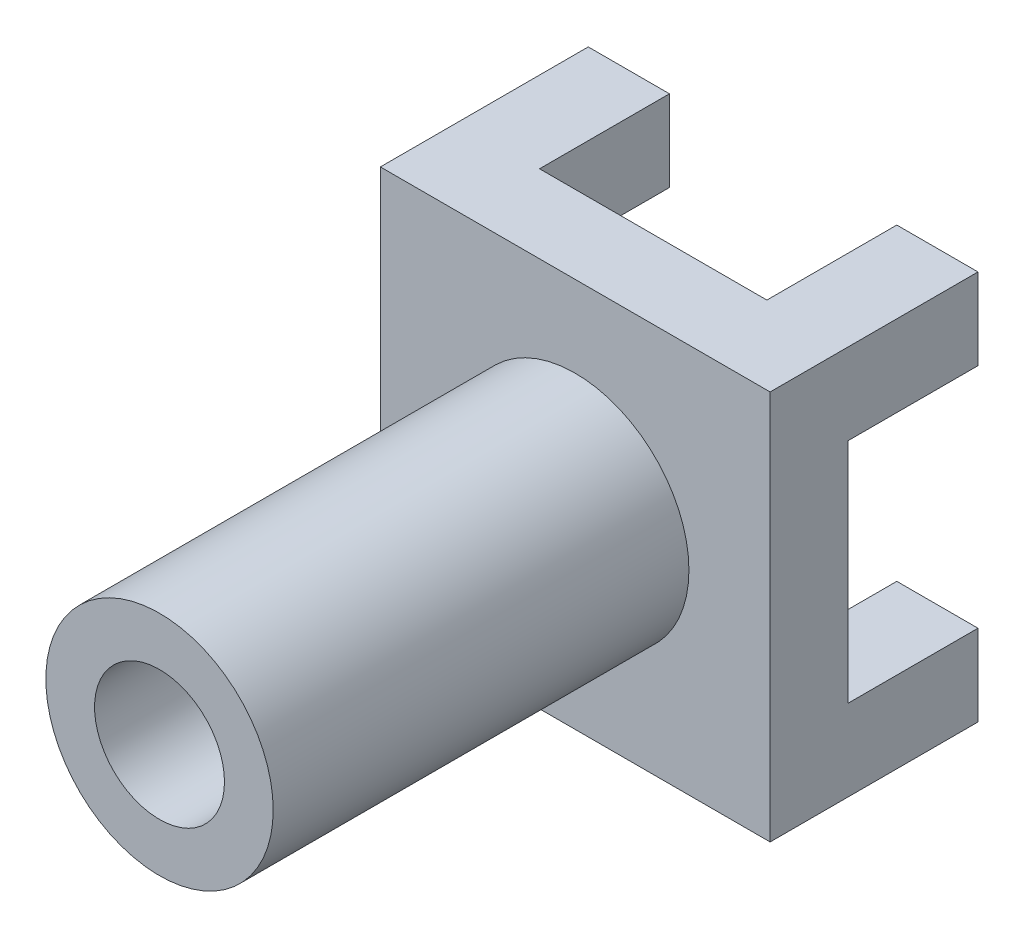
ISO-10303-21;
HEADER;
FILE_DESCRIPTION(('STEP AP214'),'2;1');
FILE_NAME('part.step','',(''),(''),'','','');
FILE_SCHEMA(('AUTOMOTIVE_DESIGN { 1 0 10303 214 1 1 1 1 }'));
ENDSEC;
DATA;
#1=APPLICATION_CONTEXT('core data for automotive mechanical design processes');
#2=APPLICATION_PROTOCOL_DEFINITION('international standard','automotive_design',2000,#1);
#3=PRODUCT_CONTEXT('',#1,'mechanical');
#4=PRODUCT('Part','Part','',(#3));
#5=PRODUCT_RELATED_PRODUCT_CATEGORY('part','',(#4));
#6=PRODUCT_DEFINITION_FORMATION('','',#4);
#7=PRODUCT_DEFINITION_CONTEXT('part definition',#1,'design');
#8=PRODUCT_DEFINITION('design','',#6,#7);
#9=PRODUCT_DEFINITION_SHAPE('','',#8);
#10=(LENGTH_UNIT() NAMED_UNIT(*) SI_UNIT(.MILLI.,.METRE.));
#11=(NAMED_UNIT(*) PLANE_ANGLE_UNIT() SI_UNIT($,.RADIAN.));
#12=(NAMED_UNIT(*) SI_UNIT($,.STERADIAN.) SOLID_ANGLE_UNIT());
#13=UNCERTAINTY_MEASURE_WITH_UNIT(LENGTH_MEASURE(1.E-05),#10,'distance_accuracy_value','');
#14=(GEOMETRIC_REPRESENTATION_CONTEXT(3) GLOBAL_UNCERTAINTY_ASSIGNED_CONTEXT((#13)) GLOBAL_UNIT_ASSIGNED_CONTEXT((#10,
#11,#12)) REPRESENTATION_CONTEXT('',''));
#15=CARTESIAN_POINT('',(0.,0.,0.));
#16=DIRECTION('',(0.,0.,1.));
#17=DIRECTION('',(1.,0.,0.));
#18=AXIS2_PLACEMENT_3D('',#15,#16,#17);
#19=CARTESIAN_POINT('',(0.,0.,-12.));
#20=DIRECTION('',(0.,0.,-1.));
#21=DIRECTION('',(-1.,0.,0.));
#22=AXIS2_PLACEMENT_3D('',#19,#20,#21);
#23=PLANE('',#22);
#24=CARTESIAN_POINT('',(30.,30.,-12.));
#25=DIRECTION('',(0.,0.,1.));
#26=DIRECTION('',(1.,0.,0.));
#27=AXIS2_PLACEMENT_3D('',#24,#25,#26);
#28=CIRCLE('',#27,10.);
#29=CARTESIAN_POINT('',(40.,30.,-12.));
#30=VERTEX_POINT('',#29);
#31=EDGE_CURVE('E296',#30,#30,#28,.T.);
#32=ORIENTED_EDGE('',*,*,#31,.T.);
#33=EDGE_LOOP('',(#32));
#34=FACE_BOUND('',#33,.T.);
#35=DIRECTION('',(1.,0.,0.));
#36=VECTOR('',#35,1.);
#37=CARTESIAN_POINT('',(0.,0.,-12.));
#38=LINE('',#37,#36);
#39=CARTESIAN_POINT('',(12.5,0.,-12.));
#40=VERTEX_POINT('',#39);
#41=CARTESIAN_POINT('',(47.5,0.,-12.));
#42=VERTEX_POINT('',#41);
#43=EDGE_CURVE('E187',#40,#42,#38,.T.);
#44=ORIENTED_EDGE('',*,*,#43,.F.);
#45=DIRECTION('',(0.,1.,0.));
#46=VECTOR('',#45,1.);
#47=CARTESIAN_POINT('',(12.5,0.,-12.));
#48=LINE('',#47,#46);
#49=CARTESIAN_POINT('',(12.5,12.5,-12.));
#50=VERTEX_POINT('',#49);
#51=EDGE_CURVE('E63',#40,#50,#48,.T.);
#52=ORIENTED_EDGE('',*,*,#51,.T.);
#53=DIRECTION('',(1.,0.,0.));
#54=VECTOR('',#53,1.);
#55=CARTESIAN_POINT('',(0.,12.5,-12.));
#56=LINE('',#55,#54);
#57=CARTESIAN_POINT('',(0.,12.5,-12.));
#58=VERTEX_POINT('',#57);
#59=EDGE_CURVE('E166',#58,#50,#56,.T.);
#60=ORIENTED_EDGE('',*,*,#59,.F.);
#61=DIRECTION('',(0.,-1.,0.));
#62=VECTOR('',#61,1.);
#63=CARTESIAN_POINT('',(0.,0.,-12.));
#64=LINE('',#63,#62);
#65=CARTESIAN_POINT('',(0.,47.5,-12.));
#66=VERTEX_POINT('',#65);
#67=EDGE_CURVE('E179',#66,#58,#64,.T.);
#68=ORIENTED_EDGE('',*,*,#67,.F.);
#69=DIRECTION('',(-1.,0.,0.));
#70=VECTOR('',#69,1.);
#71=CARTESIAN_POINT('',(0.,47.5,-12.));
#72=LINE('',#71,#70);
#73=CARTESIAN_POINT('',(12.5,47.5,-12.));
#74=VERTEX_POINT('',#73);
#75=EDGE_CURVE('E232',#74,#66,#72,.T.);
#76=ORIENTED_EDGE('',*,*,#75,.F.);
#77=DIRECTION('',(0.,-1.,0.));
#78=VECTOR('',#77,1.);
#79=CARTESIAN_POINT('',(12.5,60.,-12.));
#80=LINE('',#79,#78);
#81=CARTESIAN_POINT('',(12.5,60.,-12.));
#82=VERTEX_POINT('',#81);
#83=EDGE_CURVE('E236',#82,#74,#80,.T.);
#84=ORIENTED_EDGE('',*,*,#83,.F.);
#85=DIRECTION('',(-1.,0.,0.));
#86=VECTOR('',#85,1.);
#87=CARTESIAN_POINT('',(0.,60.,-12.));
#88=LINE('',#87,#86);
#89=CARTESIAN_POINT('',(47.5,60.,-12.));
#90=VERTEX_POINT('',#89);
#91=EDGE_CURVE('E198',#90,#82,#88,.T.);
#92=ORIENTED_EDGE('',*,*,#91,.F.);
#93=DIRECTION('',(0.,1.,0.));
#94=VECTOR('',#93,1.);
#95=CARTESIAN_POINT('',(47.5,47.5,-12.));
#96=LINE('',#95,#94);
#97=CARTESIAN_POINT('',(47.5,47.5,-12.));
#98=VERTEX_POINT('',#97);
#99=EDGE_CURVE('E271',#98,#90,#96,.T.);
#100=ORIENTED_EDGE('',*,*,#99,.F.);
#101=DIRECTION('',(-1.,0.,0.));
#102=VECTOR('',#101,1.);
#103=CARTESIAN_POINT('',(47.5,47.5,-12.));
#104=LINE('',#103,#102);
#105=CARTESIAN_POINT('',(60.,47.5,-12.));
#106=VERTEX_POINT('',#105);
#107=EDGE_CURVE('E276',#106,#98,#104,.T.);
#108=ORIENTED_EDGE('',*,*,#107,.F.);
#109=DIRECTION('',(0.,1.,0.));
#110=VECTOR('',#109,1.);
#111=CARTESIAN_POINT('',(60.,0.,-12.));
#112=LINE('',#111,#110);
#113=CARTESIAN_POINT('',(60.,12.5,-12.));
#114=VERTEX_POINT('',#113);
#115=EDGE_CURVE('E190',#114,#106,#112,.T.);
#116=ORIENTED_EDGE('',*,*,#115,.F.);
#117=DIRECTION('',(1.,0.,0.));
#118=VECTOR('',#117,1.);
#119=CARTESIAN_POINT('',(60.,12.5,-12.));
#120=LINE('',#119,#118);
#121=CARTESIAN_POINT('',(47.5,12.5,-12.));
#122=VERTEX_POINT('',#121);
#123=EDGE_CURVE('E256',#122,#114,#120,.T.);
#124=ORIENTED_EDGE('',*,*,#123,.F.);
#125=DIRECTION('',(0.,1.,0.));
#126=VECTOR('',#125,1.);
#127=CARTESIAN_POINT('',(47.5,0.,-12.));
#128=LINE('',#127,#126);
#129=EDGE_CURVE('E251',#42,#122,#128,.T.);
#130=ORIENTED_EDGE('',*,*,#129,.F.);
#131=EDGE_LOOP('',(#44,#52,#60,#68,#76,#84,#92,#100,#108,#116,#124,#130));
#132=FACE_BOUND('',#131,.T.);
#133=ADVANCED_FACE('F46',(#34,#132),#23,.T.);
#134=CARTESIAN_POINT('',(0.,0.,-12.));
#135=DIRECTION('',(-1.,0.,0.));
#136=DIRECTION('',(0.,-1.,0.));
#137=AXIS2_PLACEMENT_3D('',#134,#135,#136);
#138=PLANE('',#137);
#139=DIRECTION('',(0.,-1.,0.));
#140=VECTOR('',#139,1.);
#141=CARTESIAN_POINT('',(0.,0.,0.));
#142=LINE('',#141,#140);
#143=CARTESIAN_POINT('',(0.,60.,0.));
#144=VERTEX_POINT('',#143);
#145=CARTESIAN_POINT('',(0.,0.,0.));
#146=VERTEX_POINT('',#145);
#147=EDGE_CURVE('E201',#144,#146,#142,.T.);
#148=ORIENTED_EDGE('',*,*,#147,.F.);
#149=DIRECTION('',(0.,0.,1.));
#150=VECTOR('',#149,1.);
#151=CARTESIAN_POINT('',(0.,60.,-12.));
#152=LINE('',#151,#150);
#153=CARTESIAN_POINT('',(0.,60.,-32.));
#154=VERTEX_POINT('',#153);
#155=EDGE_CURVE('E55',#154,#144,#152,.T.);
#156=ORIENTED_EDGE('',*,*,#155,.F.);
#157=DIRECTION('',(0.,1.,0.));
#158=VECTOR('',#157,1.);
#159=CARTESIAN_POINT('',(0.,60.,-32.));
#160=LINE('',#159,#158);
#161=CARTESIAN_POINT('',(0.,47.5,-32.));
#162=VERTEX_POINT('',#161);
#163=EDGE_CURVE('E230',#162,#154,#160,.T.);
#164=ORIENTED_EDGE('',*,*,#163,.F.);
#165=DIRECTION('',(0.,0.,1.));
#166=VECTOR('',#165,1.);
#167=CARTESIAN_POINT('',(0.,47.5,-32.));
#168=LINE('',#167,#166);
#169=EDGE_CURVE('E186',#162,#66,#168,.T.);
#170=ORIENTED_EDGE('',*,*,#169,.T.);
#171=ORIENTED_EDGE('',*,*,#67,.T.);
#172=DIRECTION('',(0.,0.,-1.));
#173=VECTOR('',#172,1.);
#174=CARTESIAN_POINT('',(0.,12.5,-12.));
#175=LINE('',#174,#173);
#176=CARTESIAN_POINT('',(0.,12.5,-32.));
#177=VERTEX_POINT('',#176);
#178=EDGE_CURVE('E163',#58,#177,#175,.T.);
#179=ORIENTED_EDGE('',*,*,#178,.T.);
#180=DIRECTION('',(0.,1.,0.));
#181=VECTOR('',#180,1.);
#182=CARTESIAN_POINT('',(0.,0.,-32.));
#183=LINE('',#182,#181);
#184=CARTESIAN_POINT('',(0.,0.,-32.));
#185=VERTEX_POINT('',#184);
#186=EDGE_CURVE('E217',#185,#177,#183,.T.);
#187=ORIENTED_EDGE('',*,*,#186,.F.);
#188=DIRECTION('',(0.,0.,1.));
#189=VECTOR('',#188,1.);
#190=CARTESIAN_POINT('',(0.,0.,-12.));
#191=LINE('',#190,#189);
#192=EDGE_CURVE('E50',#185,#146,#191,.T.);
#193=ORIENTED_EDGE('',*,*,#192,.T.);
#194=EDGE_LOOP('',(#148,#156,#164,#170,#171,#179,#187,#193));
#195=FACE_BOUND('',#194,.T.);
#196=ADVANCED_FACE('F48',(#195),#138,.T.);
#197=CARTESIAN_POINT('',(0.,60.,-12.));
#198=DIRECTION('',(0.,1.,0.));
#199=DIRECTION('',(0.,0.,1.));
#200=AXIS2_PLACEMENT_3D('',#197,#198,#199);
#201=PLANE('',#200);
#202=DIRECTION('',(-1.,0.,0.));
#203=VECTOR('',#202,1.);
#204=CARTESIAN_POINT('',(0.,60.,0.));
#205=LINE('',#204,#203);
#206=CARTESIAN_POINT('',(60.,60.,0.));
#207=VERTEX_POINT('',#206);
#208=EDGE_CURVE('E188',#207,#144,#205,.T.);
#209=ORIENTED_EDGE('',*,*,#208,.F.);
#210=DIRECTION('',(0.,0.,1.));
#211=VECTOR('',#210,1.);
#212=CARTESIAN_POINT('',(60.,60.,-12.));
#213=LINE('',#212,#211);
#214=CARTESIAN_POINT('',(60.,60.,-32.));
#215=VERTEX_POINT('',#214);
#216=EDGE_CURVE('E211',#215,#207,#213,.T.);
#217=ORIENTED_EDGE('',*,*,#216,.F.);
#218=DIRECTION('',(1.,0.,0.));
#219=VECTOR('',#218,1.);
#220=CARTESIAN_POINT('',(47.5,60.,-32.));
#221=LINE('',#220,#219);
#222=CARTESIAN_POINT('',(47.5,60.,-32.));
#223=VERTEX_POINT('',#222);
#224=EDGE_CURVE('E275',#223,#215,#221,.T.);
#225=ORIENTED_EDGE('',*,*,#224,.F.);
#226=DIRECTION('',(0.,0.,1.));
#227=VECTOR('',#226,1.);
#228=CARTESIAN_POINT('',(47.5,60.,-32.));
#229=LINE('',#228,#227);
#230=EDGE_CURVE('E292',#223,#90,#229,.T.);
#231=ORIENTED_EDGE('',*,*,#230,.T.);
#232=ORIENTED_EDGE('',*,*,#91,.T.);
#233=DIRECTION('',(0.,0.,1.));
#234=VECTOR('',#233,1.);
#235=CARTESIAN_POINT('',(12.5,60.,-32.));
#236=LINE('',#235,#234);
#237=CARTESIAN_POINT('',(12.5,60.,-32.));
#238=VERTEX_POINT('',#237);
#239=EDGE_CURVE('E249',#238,#82,#236,.T.);
#240=ORIENTED_EDGE('',*,*,#239,.F.);
#241=DIRECTION('',(1.,0.,0.));
#242=VECTOR('',#241,1.);
#243=CARTESIAN_POINT('',(0.,60.,-32.));
#244=LINE('',#243,#242);
#245=EDGE_CURVE('E228',#154,#238,#244,.T.);
#246=ORIENTED_EDGE('',*,*,#245,.F.);
#247=ORIENTED_EDGE('',*,*,#155,.T.);
#248=EDGE_LOOP('',(#209,#217,#225,#231,#232,#240,#246,#247));
#249=FACE_BOUND('',#248,.T.);
#250=ADVANCED_FACE('F224',(#249),#201,.T.);
#251=CARTESIAN_POINT('',(60.,0.,-12.));
#252=DIRECTION('',(1.,0.,0.));
#253=DIRECTION('',(0.,1.,0.));
#254=AXIS2_PLACEMENT_3D('',#251,#252,#253);
#255=PLANE('',#254);
#256=DIRECTION('',(0.,1.,0.));
#257=VECTOR('',#256,1.);
#258=CARTESIAN_POINT('',(60.,0.,0.));
#259=LINE('',#258,#257);
#260=CARTESIAN_POINT('',(60.,0.,0.));
#261=VERTEX_POINT('',#260);
#262=EDGE_CURVE('E193',#261,#207,#259,.T.);
#263=ORIENTED_EDGE('',*,*,#262,.F.);
#264=DIRECTION('',(0.,0.,1.));
#265=VECTOR('',#264,1.);
#266=CARTESIAN_POINT('',(60.,0.,-12.));
#267=LINE('',#266,#265);
#268=CARTESIAN_POINT('',(60.,0.,-32.));
#269=VERTEX_POINT('',#268);
#270=EDGE_CURVE('E212',#269,#261,#267,.T.);
#271=ORIENTED_EDGE('',*,*,#270,.F.);
#272=DIRECTION('',(0.,-1.,0.));
#273=VECTOR('',#272,1.);
#274=CARTESIAN_POINT('',(60.,0.,-32.));
#275=LINE('',#274,#273);
#276=CARTESIAN_POINT('',(60.,12.5,-32.));
#277=VERTEX_POINT('',#276);
#278=EDGE_CURVE('E252',#277,#269,#275,.T.);
#279=ORIENTED_EDGE('',*,*,#278,.F.);
#280=DIRECTION('',(0.,0.,1.));
#281=VECTOR('',#280,1.);
#282=CARTESIAN_POINT('',(60.,12.5,-32.));
#283=LINE('',#282,#281);
#284=EDGE_CURVE('E262',#277,#114,#283,.T.);
#285=ORIENTED_EDGE('',*,*,#284,.T.);
#286=ORIENTED_EDGE('',*,*,#115,.T.);
#287=DIRECTION('',(0.,0.,1.));
#288=VECTOR('',#287,1.);
#289=CARTESIAN_POINT('',(60.,47.5,-32.));
#290=LINE('',#289,#288);
#291=CARTESIAN_POINT('',(60.,47.5,-32.));
#292=VERTEX_POINT('',#291);
#293=EDGE_CURVE('E289',#292,#106,#290,.T.);
#294=ORIENTED_EDGE('',*,*,#293,.F.);
#295=DIRECTION('',(0.,-1.,0.));
#296=VECTOR('',#295,1.);
#297=CARTESIAN_POINT('',(60.,47.5,-32.));
#298=LINE('',#297,#296);
#299=EDGE_CURVE('E278',#215,#292,#298,.T.);
#300=ORIENTED_EDGE('',*,*,#299,.F.);
#301=ORIENTED_EDGE('',*,*,#216,.T.);
#302=EDGE_LOOP('',(#263,#271,#279,#285,#286,#294,#300,#301));
#303=FACE_BOUND('',#302,.T.);
#304=ADVANCED_FACE('F316',(#303),#255,.T.);
#305=CARTESIAN_POINT('',(0.,0.,-12.));
#306=DIRECTION('',(0.,-1.,0.));
#307=DIRECTION('',(0.,0.,-1.));
#308=AXIS2_PLACEMENT_3D('',#305,#306,#307);
#309=PLANE('',#308);
#310=DIRECTION('',(1.,0.,0.));
#311=VECTOR('',#310,1.);
#312=CARTESIAN_POINT('',(0.,0.,0.));
#313=LINE('',#312,#311);
#314=EDGE_CURVE('E204',#146,#261,#313,.T.);
#315=ORIENTED_EDGE('',*,*,#314,.F.);
#316=ORIENTED_EDGE('',*,*,#192,.F.);
#317=DIRECTION('',(1.,0.,0.));
#318=VECTOR('',#317,1.);
#319=CARTESIAN_POINT('',(0.,0.,-32.));
#320=LINE('',#319,#318);
#321=CARTESIAN_POINT('',(12.5,0.,-32.));
#322=VERTEX_POINT('',#321);
#323=EDGE_CURVE('E180',#185,#322,#320,.T.);
#324=ORIENTED_EDGE('',*,*,#323,.T.);
#325=DIRECTION('',(0.,0.,-1.));
#326=VECTOR('',#325,1.);
#327=CARTESIAN_POINT('',(12.5,0.,-12.));
#328=LINE('',#327,#326);
#329=EDGE_CURVE('E243',#40,#322,#328,.T.);
#330=ORIENTED_EDGE('',*,*,#329,.F.);
#331=ORIENTED_EDGE('',*,*,#43,.T.);
#332=DIRECTION('',(0.,0.,1.));
#333=VECTOR('',#332,1.);
#334=CARTESIAN_POINT('',(47.5,0.,-32.));
#335=LINE('',#334,#333);
#336=CARTESIAN_POINT('',(47.5,0.,-32.));
#337=VERTEX_POINT('',#336);
#338=EDGE_CURVE('E268',#337,#42,#335,.T.);
#339=ORIENTED_EDGE('',*,*,#338,.F.);
#340=DIRECTION('',(-1.,0.,0.));
#341=VECTOR('',#340,1.);
#342=CARTESIAN_POINT('',(60.,0.,-32.));
#343=LINE('',#342,#341);
#344=EDGE_CURVE('E255',#269,#337,#343,.T.);
#345=ORIENTED_EDGE('',*,*,#344,.F.);
#346=ORIENTED_EDGE('',*,*,#270,.T.);
#347=EDGE_LOOP('',(#315,#316,#324,#330,#331,#339,#345,#346));
#348=FACE_BOUND('',#347,.T.);
#349=ADVANCED_FACE('F219',(#348),#309,.T.);
#350=CARTESIAN_POINT('',(0.,0.,0.));
#351=DIRECTION('',(0.,0.,-1.));
#352=DIRECTION('',(-1.,0.,0.));
#353=AXIS2_PLACEMENT_3D('',#350,#351,#352);
#354=PLANE('',#353);
#355=CARTESIAN_POINT('',(30.,30.,0.));
#356=DIRECTION('',(0.,0.,1.));
#357=DIRECTION('',(1.,0.,0.));
#358=AXIS2_PLACEMENT_3D('',#355,#356,#357);
#359=CIRCLE('',#358,17.5);
#360=CARTESIAN_POINT('',(47.5,30.,0.));
#361=VERTEX_POINT('',#360);
#362=EDGE_CURVE('E13',#361,#361,#359,.T.);
#363=ORIENTED_EDGE('',*,*,#362,.F.);
#364=EDGE_LOOP('',(#363));
#365=FACE_BOUND('',#364,.T.);
#366=ORIENTED_EDGE('',*,*,#147,.T.);
#367=ORIENTED_EDGE('',*,*,#314,.T.);
#368=ORIENTED_EDGE('',*,*,#262,.T.);
#369=ORIENTED_EDGE('',*,*,#208,.T.);
#370=EDGE_LOOP('',(#366,#367,#368,#369));
#371=FACE_BOUND('',#370,.T.);
#372=ADVANCED_FACE('F221',(#365,#371),#354,.F.);
#373=CARTESIAN_POINT('',(30.,30.,64.));
#374=DIRECTION('',(0.,0.,-1.));
#375=DIRECTION('',(-1.,0.,0.));
#376=AXIS2_PLACEMENT_3D('',#373,#374,#375);
#377=CYLINDRICAL_SURFACE('',#376,17.5);
#378=CARTESIAN_POINT('',(30.,30.,64.));
#379=DIRECTION('',(0.,0.,1.));
#380=DIRECTION('',(1.,0.,0.));
#381=AXIS2_PLACEMENT_3D('',#378,#379,#380);
#382=CIRCLE('',#381,17.5);
#383=CARTESIAN_POINT('',(47.5,30.,64.));
#384=VERTEX_POINT('',#383);
#385=EDGE_CURVE('E205',#384,#384,#382,.T.);
#386=ORIENTED_EDGE('',*,*,#385,.F.);
#387=EDGE_LOOP('',(#386));
#388=FACE_BOUND('',#387,.T.);
#389=ORIENTED_EDGE('',*,*,#362,.T.);
#390=EDGE_LOOP('',(#389));
#391=FACE_BOUND('',#390,.T.);
#392=ADVANCED_FACE('F305',(#388,#391),#377,.T.);
#393=CARTESIAN_POINT('',(30.,30.,64.));
#394=DIRECTION('',(0.,0.,1.));
#395=DIRECTION('',(1.,0.,0.));
#396=AXIS2_PLACEMENT_3D('',#393,#394,#395);
#397=PLANE('',#396);
#398=CARTESIAN_POINT('',(30.,30.,64.));
#399=DIRECTION('',(0.,0.,1.));
#400=DIRECTION('',(1.,0.,0.));
#401=AXIS2_PLACEMENT_3D('',#398,#399,#400);
#402=CIRCLE('',#401,10.);
#403=CARTESIAN_POINT('',(40.,30.,64.));
#404=VERTEX_POINT('',#403);
#405=EDGE_CURVE('E295',#404,#404,#402,.T.);
#406=ORIENTED_EDGE('',*,*,#405,.F.);
#407=EDGE_LOOP('',(#406));
#408=FACE_BOUND('',#407,.T.);
#409=ORIENTED_EDGE('',*,*,#385,.T.);
#410=EDGE_LOOP('',(#409));
#411=FACE_BOUND('',#410,.T.);
#412=ADVANCED_FACE('F303',(#408,#411),#397,.T.);
#413=CARTESIAN_POINT('',(30.,30.,-12.));
#414=DIRECTION('',(0.,0.,1.));
#415=DIRECTION('',(1.,0.,0.));
#416=AXIS2_PLACEMENT_3D('',#413,#414,#415);
#417=CYLINDRICAL_SURFACE('',#416,10.);
#418=ORIENTED_EDGE('',*,*,#31,.F.);
#419=EDGE_LOOP('',(#418));
#420=FACE_BOUND('',#419,.T.);
#421=ORIENTED_EDGE('',*,*,#405,.T.);
#422=EDGE_LOOP('',(#421));
#423=FACE_BOUND('',#422,.T.);
#424=ADVANCED_FACE('F327',(#420,#423),#417,.F.);
#425=CARTESIAN_POINT('',(47.5,47.5,-32.));
#426=DIRECTION('',(1.,0.,0.));
#427=DIRECTION('',(0.,0.,-1.));
#428=AXIS2_PLACEMENT_3D('',#425,#426,#427);
#429=PLANE('',#428);
#430=ORIENTED_EDGE('',*,*,#99,.T.);
#431=ORIENTED_EDGE('',*,*,#230,.F.);
#432=DIRECTION('',(0.,1.,0.));
#433=VECTOR('',#432,1.);
#434=CARTESIAN_POINT('',(47.5,47.5,-32.));
#435=LINE('',#434,#433);
#436=CARTESIAN_POINT('',(47.5,47.5,-32.));
#437=VERTEX_POINT('',#436);
#438=EDGE_CURVE('E272',#437,#223,#435,.T.);
#439=ORIENTED_EDGE('',*,*,#438,.F.);
#440=DIRECTION('',(0.,0.,1.));
#441=VECTOR('',#440,1.);
#442=CARTESIAN_POINT('',(47.5,47.5,-32.));
#443=LINE('',#442,#441);
#444=EDGE_CURVE('E282',#437,#98,#443,.T.);
#445=ORIENTED_EDGE('',*,*,#444,.T.);
#446=EDGE_LOOP('',(#430,#431,#439,#445));
#447=FACE_BOUND('',#446,.T.);
#448=ADVANCED_FACE('F331',(#447),#429,.F.);
#449=CARTESIAN_POINT('',(47.5,47.5,-32.));
#450=DIRECTION('',(0.,1.,0.));
#451=DIRECTION('',(0.,0.,1.));
#452=AXIS2_PLACEMENT_3D('',#449,#450,#451);
#453=PLANE('',#452);
#454=ORIENTED_EDGE('',*,*,#107,.T.);
#455=ORIENTED_EDGE('',*,*,#444,.F.);
#456=DIRECTION('',(-1.,0.,0.));
#457=VECTOR('',#456,1.);
#458=CARTESIAN_POINT('',(47.5,47.5,-32.));
#459=LINE('',#458,#457);
#460=EDGE_CURVE('E280',#292,#437,#459,.T.);
#461=ORIENTED_EDGE('',*,*,#460,.F.);
#462=ORIENTED_EDGE('',*,*,#293,.T.);
#463=EDGE_LOOP('',(#454,#455,#461,#462));
#464=FACE_BOUND('',#463,.T.);
#465=ADVANCED_FACE('F335',(#464),#453,.F.);
#466=CARTESIAN_POINT('',(0.,0.,-32.));
#467=DIRECTION('',(0.,0.,-1.));
#468=DIRECTION('',(-1.,0.,0.));
#469=AXIS2_PLACEMENT_3D('',#466,#467,#468);
#470=PLANE('',#469);
#471=ORIENTED_EDGE('',*,*,#438,.T.);
#472=ORIENTED_EDGE('',*,*,#224,.T.);
#473=ORIENTED_EDGE('',*,*,#299,.T.);
#474=ORIENTED_EDGE('',*,*,#460,.T.);
#475=EDGE_LOOP('',(#471,#472,#473,#474));
#476=FACE_BOUND('',#475,.T.);
#477=ADVANCED_FACE('F339',(#476),#470,.T.);
#478=CARTESIAN_POINT('',(47.5,0.,-32.));
#479=DIRECTION('',(1.,0.,0.));
#480=DIRECTION('',(0.,0.,-1.));
#481=AXIS2_PLACEMENT_3D('',#478,#479,#480);
#482=PLANE('',#481);
#483=ORIENTED_EDGE('',*,*,#129,.T.);
#484=DIRECTION('',(0.,0.,1.));
#485=VECTOR('',#484,1.);
#486=CARTESIAN_POINT('',(47.5,12.5,-32.));
#487=LINE('',#486,#485);
#488=CARTESIAN_POINT('',(47.5,12.5,-32.));
#489=VERTEX_POINT('',#488);
#490=EDGE_CURVE('E71',#489,#122,#487,.T.);
#491=ORIENTED_EDGE('',*,*,#490,.F.);
#492=DIRECTION('',(0.,1.,0.));
#493=VECTOR('',#492,1.);
#494=CARTESIAN_POINT('',(47.5,0.,-32.));
#495=LINE('',#494,#493);
#496=EDGE_CURVE('E258',#337,#489,#495,.T.);
#497=ORIENTED_EDGE('',*,*,#496,.F.);
#498=ORIENTED_EDGE('',*,*,#338,.T.);
#499=EDGE_LOOP('',(#483,#491,#497,#498));
#500=FACE_BOUND('',#499,.T.);
#501=ADVANCED_FACE('F343',(#500),#482,.F.);
#502=CARTESIAN_POINT('',(60.,12.5,-32.));
#503=DIRECTION('',(0.,-1.,0.));
#504=DIRECTION('',(0.,0.,-1.));
#505=AXIS2_PLACEMENT_3D('',#502,#503,#504);
#506=PLANE('',#505);
#507=ORIENTED_EDGE('',*,*,#123,.T.);
#508=ORIENTED_EDGE('',*,*,#284,.F.);
#509=DIRECTION('',(1.,0.,0.));
#510=VECTOR('',#509,1.);
#511=CARTESIAN_POINT('',(60.,12.5,-32.));
#512=LINE('',#511,#510);
#513=EDGE_CURVE('E260',#489,#277,#512,.T.);
#514=ORIENTED_EDGE('',*,*,#513,.F.);
#515=ORIENTED_EDGE('',*,*,#490,.T.);
#516=EDGE_LOOP('',(#507,#508,#514,#515));
#517=FACE_BOUND('',#516,.T.);
#518=ADVANCED_FACE('F347',(#517),#506,.F.);
#519=CARTESIAN_POINT('',(0.,0.,-32.));
#520=DIRECTION('',(0.,0.,1.));
#521=DIRECTION('',(1.,0.,0.));
#522=AXIS2_PLACEMENT_3D('',#519,#520,#521);
#523=PLANE('',#522);
#524=ORIENTED_EDGE('',*,*,#278,.T.);
#525=ORIENTED_EDGE('',*,*,#344,.T.);
#526=ORIENTED_EDGE('',*,*,#496,.T.);
#527=ORIENTED_EDGE('',*,*,#513,.T.);
#528=EDGE_LOOP('',(#524,#525,#526,#527));
#529=FACE_BOUND('',#528,.T.);
#530=ADVANCED_FACE('F351',(#529),#523,.F.);
#531=CARTESIAN_POINT('',(12.5,60.,-32.));
#532=DIRECTION('',(-1.,0.,0.));
#533=DIRECTION('',(0.,-1.,0.));
#534=AXIS2_PLACEMENT_3D('',#531,#532,#533);
#535=PLANE('',#534);
#536=ORIENTED_EDGE('',*,*,#83,.T.);
#537=DIRECTION('',(0.,0.,1.));
#538=VECTOR('',#537,1.);
#539=CARTESIAN_POINT('',(12.5,47.5,-32.));
#540=LINE('',#539,#538);
#541=CARTESIAN_POINT('',(12.5,47.5,-32.));
#542=VERTEX_POINT('',#541);
#543=EDGE_CURVE('E246',#542,#74,#540,.T.);
#544=ORIENTED_EDGE('',*,*,#543,.F.);
#545=DIRECTION('',(0.,-1.,0.));
#546=VECTOR('',#545,1.);
#547=CARTESIAN_POINT('',(12.5,60.,-32.));
#548=LINE('',#547,#546);
#549=EDGE_CURVE('E234',#238,#542,#548,.T.);
#550=ORIENTED_EDGE('',*,*,#549,.F.);
#551=ORIENTED_EDGE('',*,*,#239,.T.);
#552=EDGE_LOOP('',(#536,#544,#550,#551));
#553=FACE_BOUND('',#552,.T.);
#554=ADVANCED_FACE('F354',(#553),#535,.F.);
#555=CARTESIAN_POINT('',(0.,47.5,-32.));
#556=DIRECTION('',(0.,1.,0.));
#557=DIRECTION('',(0.,0.,1.));
#558=AXIS2_PLACEMENT_3D('',#555,#556,#557);
#559=PLANE('',#558);
#560=ORIENTED_EDGE('',*,*,#75,.T.);
#561=ORIENTED_EDGE('',*,*,#169,.F.);
#562=DIRECTION('',(-1.,0.,0.));
#563=VECTOR('',#562,1.);
#564=CARTESIAN_POINT('',(0.,47.5,-32.));
#565=LINE('',#564,#563);
#566=EDGE_CURVE('E241',#542,#162,#565,.T.);
#567=ORIENTED_EDGE('',*,*,#566,.F.);
#568=ORIENTED_EDGE('',*,*,#543,.T.);
#569=EDGE_LOOP('',(#560,#561,#567,#568));
#570=FACE_BOUND('',#569,.T.);
#571=ADVANCED_FACE('F358',(#570),#559,.F.);
#572=CARTESIAN_POINT('',(0.,0.,-32.));
#573=DIRECTION('',(0.,0.,1.));
#574=DIRECTION('',(1.,0.,0.));
#575=AXIS2_PLACEMENT_3D('',#572,#573,#574);
#576=PLANE('',#575);
#577=ORIENTED_EDGE('',*,*,#163,.T.);
#578=ORIENTED_EDGE('',*,*,#245,.T.);
#579=ORIENTED_EDGE('',*,*,#549,.T.);
#580=ORIENTED_EDGE('',*,*,#566,.T.);
#581=EDGE_LOOP('',(#577,#578,#579,#580));
#582=FACE_BOUND('',#581,.T.);
#583=ADVANCED_FACE('F362',(#582),#576,.F.);
#584=CARTESIAN_POINT('',(12.5,0.,-12.));
#585=DIRECTION('',(-1.,0.,0.));
#586=DIRECTION('',(0.,0.,1.));
#587=AXIS2_PLACEMENT_3D('',#584,#585,#586);
#588=PLANE('',#587);
#589=DIRECTION('',(0.,1.,0.));
#590=VECTOR('',#589,1.);
#591=CARTESIAN_POINT('',(12.5,0.,-32.));
#592=LINE('',#591,#590);
#593=CARTESIAN_POINT('',(12.5,12.5,-32.));
#594=VERTEX_POINT('',#593);
#595=EDGE_CURVE('E378',#322,#594,#592,.T.);
#596=ORIENTED_EDGE('',*,*,#595,.T.);
#597=DIRECTION('',(0.,0.,-1.));
#598=VECTOR('',#597,1.);
#599=CARTESIAN_POINT('',(12.5,12.5,-12.));
#600=LINE('',#599,#598);
#601=EDGE_CURVE('E173',#50,#594,#600,.T.);
#602=ORIENTED_EDGE('',*,*,#601,.F.);
#603=ORIENTED_EDGE('',*,*,#51,.F.);
#604=ORIENTED_EDGE('',*,*,#329,.T.);
#605=EDGE_LOOP('',(#596,#602,#603,#604));
#606=FACE_BOUND('',#605,.T.);
#607=ADVANCED_FACE('F366',(#606),#588,.F.);
#608=CARTESIAN_POINT('',(0.,12.5,-12.));
#609=DIRECTION('',(0.,1.,0.));
#610=DIRECTION('',(-1.,0.,0.));
#611=AXIS2_PLACEMENT_3D('',#608,#609,#610);
#612=PLANE('',#611);
#613=DIRECTION('',(1.,0.,0.));
#614=VECTOR('',#613,1.);
#615=CARTESIAN_POINT('',(0.,12.5,-32.));
#616=LINE('',#615,#614);
#617=EDGE_CURVE('E168',#177,#594,#616,.T.);
#618=ORIENTED_EDGE('',*,*,#617,.F.);
#619=ORIENTED_EDGE('',*,*,#178,.F.);
#620=ORIENTED_EDGE('',*,*,#59,.T.);
#621=ORIENTED_EDGE('',*,*,#601,.T.);
#622=EDGE_LOOP('',(#618,#619,#620,#621));
#623=FACE_BOUND('',#622,.T.);
#624=ADVANCED_FACE('F165',(#623),#612,.T.);
#625=CARTESIAN_POINT('',(0.,0.,-32.));
#626=DIRECTION('',(0.,0.,-1.));
#627=DIRECTION('',(-1.,0.,0.));
#628=AXIS2_PLACEMENT_3D('',#625,#626,#627);
#629=PLANE('',#628);
#630=ORIENTED_EDGE('',*,*,#186,.T.);
#631=ORIENTED_EDGE('',*,*,#617,.T.);
#632=ORIENTED_EDGE('',*,*,#595,.F.);
#633=ORIENTED_EDGE('',*,*,#323,.F.);
#634=EDGE_LOOP('',(#630,#631,#632,#633));
#635=FACE_BOUND('',#634,.T.);
#636=ADVANCED_FACE('F369',(#635),#629,.T.);
#637=CLOSED_SHELL('',(#133,#196,#250,#304,#349,#372,#392,#412,#424,#448,#465,#477,#501,#518,
#530,#554,#571,#583,#607,#624,#636));
#638=MANIFOLD_SOLID_BREP('B2',#637);
#639=ADVANCED_BREP_SHAPE_REPRESENTATION('',(#18,#638),#14);
#640=SHAPE_DEFINITION_REPRESENTATION(#9,#639);
ENDSEC;
END-ISO-10303-21;
